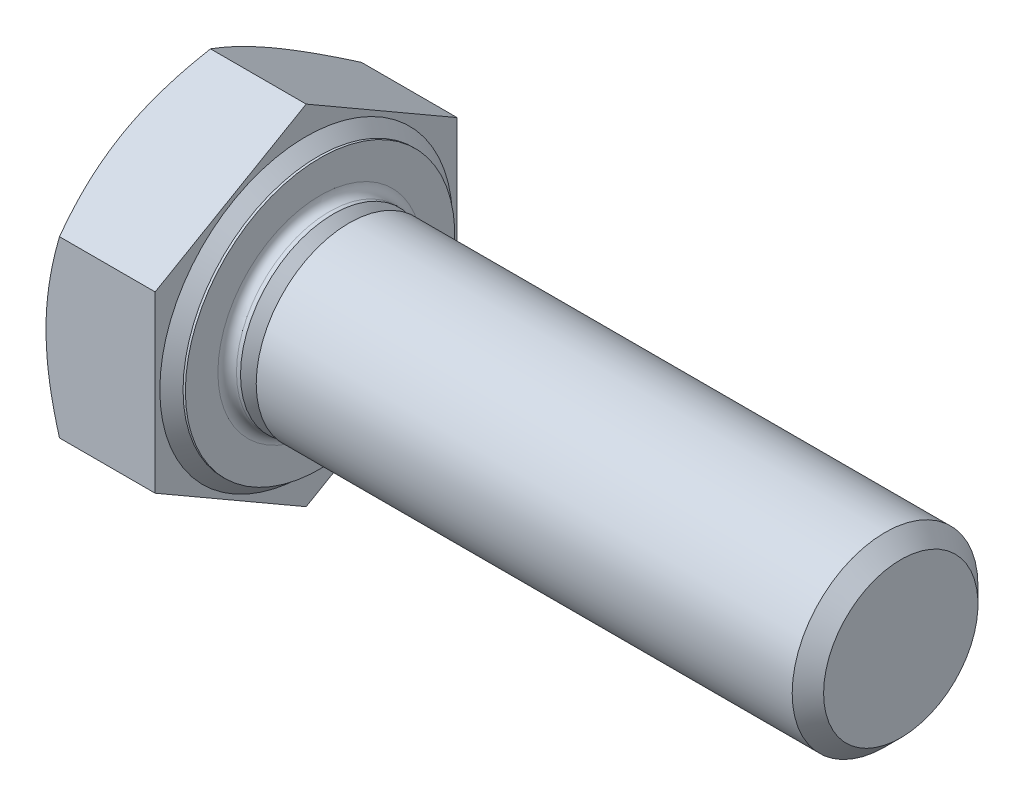
ISO-10303-21;
HEADER;
FILE_DESCRIPTION(('STEP AP214'),'2;1');
FILE_NAME('part.step','',(''),(''),'','','');
FILE_SCHEMA(('AUTOMOTIVE_DESIGN { 1 0 10303 214 1 1 1 1 }'));
ENDSEC;
DATA;
#1=APPLICATION_CONTEXT('core data for automotive mechanical design processes');
#2=APPLICATION_PROTOCOL_DEFINITION('international standard','automotive_design',2000,#1);
#3=PRODUCT_CONTEXT('',#1,'mechanical');
#4=PRODUCT('Part','Part','',(#3));
#5=PRODUCT_RELATED_PRODUCT_CATEGORY('part','',(#4));
#6=PRODUCT_DEFINITION_FORMATION('','',#4);
#7=PRODUCT_DEFINITION_CONTEXT('part definition',#1,'design');
#8=PRODUCT_DEFINITION('design','',#6,#7);
#9=PRODUCT_DEFINITION_SHAPE('','',#8);
#10=(LENGTH_UNIT() NAMED_UNIT(*) SI_UNIT(.MILLI.,.METRE.));
#11=(NAMED_UNIT(*) PLANE_ANGLE_UNIT() SI_UNIT($,.RADIAN.));
#12=(NAMED_UNIT(*) SI_UNIT($,.STERADIAN.) SOLID_ANGLE_UNIT());
#13=UNCERTAINTY_MEASURE_WITH_UNIT(LENGTH_MEASURE(1.E-05),#10,'distance_accuracy_value','');
#14=(GEOMETRIC_REPRESENTATION_CONTEXT(3) GLOBAL_UNCERTAINTY_ASSIGNED_CONTEXT((#13)) GLOBAL_UNIT_ASSIGNED_CONTEXT((#10,
#11,#12)) REPRESENTATION_CONTEXT('',''));
#15=CARTESIAN_POINT('',(0.,0.,0.));
#16=DIRECTION('',(0.,0.,1.));
#17=DIRECTION('',(1.,0.,0.));
#18=AXIS2_PLACEMENT_3D('',#15,#16,#17);
#19=CARTESIAN_POINT('',(0.,0.,0.));
#20=DIRECTION('',(-1.,0.,0.));
#21=DIRECTION('',(0.,0.,1.));
#22=AXIS2_PLACEMENT_3D('',#19,#20,#21);
#23=CYLINDRICAL_SURFACE('',#22,4.);
#24=CARTESIAN_POINT('',(1.,0.,0.));
#25=DIRECTION('',(-1.,0.,0.));
#26=DIRECTION('',(0.,0.,1.));
#27=AXIS2_PLACEMENT_3D('',#24,#25,#26);
#28=CIRCLE('',#27,4.);
#29=CARTESIAN_POINT('',(1.,0.,4.));
#30=VERTEX_POINT('',#29);
#31=EDGE_CURVE('E11',#30,#30,#28,.T.);
#32=ORIENTED_EDGE('',*,*,#31,.F.);
#33=EDGE_LOOP('',(#32));
#34=FACE_BOUND('',#33,.T.);
#35=CARTESIAN_POINT('',(1.1734375,0.,0.));
#36=DIRECTION('',(-1.,0.,0.));
#37=DIRECTION('',(0.,0.,1.));
#38=AXIS2_PLACEMENT_3D('',#35,#36,#37);
#39=CIRCLE('',#38,4.);
#40=CARTESIAN_POINT('',(1.1734375,0.,4.));
#41=VERTEX_POINT('',#40);
#42=EDGE_CURVE('E248',#41,#41,#39,.T.);
#43=ORIENTED_EDGE('',*,*,#42,.T.);
#44=EDGE_LOOP('',(#43));
#45=FACE_BOUND('',#44,.T.);
#46=ADVANCED_FACE('F16',(#34,#45),#23,.T.);
#47=CARTESIAN_POINT('',(25.6,0.,0.));
#48=DIRECTION('',(-1.,0.,0.));
#49=DIRECTION('',(0.,0.,1.));
#50=AXIS2_PLACEMENT_3D('',#47,#48,#49);
#51=PLANE('',#50);
#52=CARTESIAN_POINT('',(25.6,0.,0.));
#53=DIRECTION('',(-1.,0.,0.));
#54=DIRECTION('',(0.,0.,1.));
#55=AXIS2_PLACEMENT_3D('',#52,#53,#54);
#56=CIRCLE('',#55,3.3234375);
#57=CARTESIAN_POINT('',(25.6,0.,3.3234375));
#58=VERTEX_POINT('',#57);
#59=EDGE_CURVE('E128',#58,#58,#56,.T.);
#60=ORIENTED_EDGE('',*,*,#59,.F.);
#61=EDGE_LOOP('',(#60));
#62=FACE_BOUND('',#61,.T.);
#63=ADVANCED_FACE('F151',(#62),#51,.F.);
#64=CARTESIAN_POINT('',(25.6,0.,0.));
#65=DIRECTION('',(-1.,0.,0.));
#66=DIRECTION('',(0.,0.,1.));
#67=AXIS2_PLACEMENT_3D('',#64,#65,#66);
#68=CONICAL_SURFACE('',#67,3.3234375,0.785398163397447);
#69=CARTESIAN_POINT('',(24.9234375,0.,0.));
#70=DIRECTION('',(-1.,0.,0.));
#71=DIRECTION('',(0.,0.,1.));
#72=AXIS2_PLACEMENT_3D('',#69,#70,#71);
#73=CIRCLE('',#72,4.);
#74=CARTESIAN_POINT('',(24.9234375,0.,4.));
#75=VERTEX_POINT('',#74);
#76=EDGE_CURVE('E230',#75,#75,#73,.T.);
#77=ORIENTED_EDGE('',*,*,#76,.F.);
#78=EDGE_LOOP('',(#77));
#79=FACE_BOUND('',#78,.T.);
#80=ORIENTED_EDGE('',*,*,#59,.T.);
#81=EDGE_LOOP('',(#80));
#82=FACE_BOUND('',#81,.T.);
#83=ADVANCED_FACE('F204',(#79,#82),#68,.T.);
#84=CARTESIAN_POINT('',(0.,0.,0.));
#85=DIRECTION('',(-1.,0.,0.));
#86=DIRECTION('',(0.,0.,1.));
#87=AXIS2_PLACEMENT_3D('',#84,#85,#86);
#88=CYLINDRICAL_SURFACE('',#87,4.);
#89=CARTESIAN_POINT('',(1.85,0.,0.));
#90=DIRECTION('',(-1.,0.,0.));
#91=DIRECTION('',(0.,0.,1.));
#92=AXIS2_PLACEMENT_3D('',#89,#90,#91);
#93=CIRCLE('',#92,4.);
#94=CARTESIAN_POINT('',(1.85,0.,4.));
#95=VERTEX_POINT('',#94);
#96=EDGE_CURVE('E238',#95,#95,#93,.T.);
#97=ORIENTED_EDGE('',*,*,#96,.F.);
#98=EDGE_LOOP('',(#97));
#99=FACE_BOUND('',#98,.T.);
#100=ORIENTED_EDGE('',*,*,#76,.T.);
#101=EDGE_LOOP('',(#100));
#102=FACE_BOUND('',#101,.T.);
#103=ADVANCED_FACE('F219',(#99,#102),#88,.T.);
#104=CARTESIAN_POINT('',(1.85,4.,0.));
#105=DIRECTION('',(1.,0.,0.));
#106=DIRECTION('',(0.,0.,-1.));
#107=AXIS2_PLACEMENT_3D('',#104,#105,#106);
#108=PLANE('',#107);
#109=CARTESIAN_POINT('',(1.85,0.,0.));
#110=DIRECTION('',(-1.,0.,0.));
#111=DIRECTION('',(0.,0.,1.));
#112=AXIS2_PLACEMENT_3D('',#109,#110,#111);
#113=CIRCLE('',#112,3.3234375);
#114=CARTESIAN_POINT('',(1.85,0.,3.3234375));
#115=VERTEX_POINT('',#114);
#116=EDGE_CURVE('E244',#115,#115,#113,.T.);
#117=ORIENTED_EDGE('',*,*,#116,.F.);
#118=EDGE_LOOP('',(#117));
#119=FACE_BOUND('',#118,.T.);
#120=ORIENTED_EDGE('',*,*,#96,.T.);
#121=EDGE_LOOP('',(#120));
#122=FACE_BOUND('',#121,.T.);
#123=ADVANCED_FACE('F215',(#119,#122),#108,.F.);
#124=CARTESIAN_POINT('',(1.85,0.,0.));
#125=DIRECTION('',(-1.,0.,0.));
#126=DIRECTION('',(0.,0.,1.));
#127=AXIS2_PLACEMENT_3D('',#124,#125,#126);
#128=CONICAL_SURFACE('',#127,3.3234375,0.785398163397448);
#129=ORIENTED_EDGE('',*,*,#42,.F.);
#130=EDGE_LOOP('',(#129));
#131=FACE_BOUND('',#130,.T.);
#132=ORIENTED_EDGE('',*,*,#116,.T.);
#133=EDGE_LOOP('',(#132));
#134=FACE_BOUND('',#133,.T.);
#135=ADVANCED_FACE('F212',(#131,#134),#128,.T.);
#136=CARTESIAN_POINT('',(1.,0.,0.));
#137=DIRECTION('',(-1.,0.,0.));
#138=DIRECTION('',(0.,0.,1.));
#139=AXIS2_PLACEMENT_3D('',#136,#137,#138);
#140=TOROIDAL_SURFACE('',#139,4.4,0.4);
#141=ORIENTED_EDGE('',*,*,#31,.T.);
#142=EDGE_LOOP('',(#141));
#143=FACE_BOUND('',#142,.T.);
#144=CARTESIAN_POINT('',(0.6,0.,0.));
#145=DIRECTION('',(-1.,0.,0.));
#146=DIRECTION('',(0.,0.,1.));
#147=AXIS2_PLACEMENT_3D('',#144,#145,#146);
#148=CIRCLE('',#147,4.4);
#149=CARTESIAN_POINT('',(0.6,0.,4.4));
#150=VERTEX_POINT('',#149);
#151=EDGE_CURVE('E252',#150,#150,#148,.T.);
#152=ORIENTED_EDGE('',*,*,#151,.F.);
#153=EDGE_LOOP('',(#152));
#154=FACE_BOUND('',#153,.T.);
#155=ADVANCED_FACE('F210',(#143,#154),#140,.F.);
#156=CARTESIAN_POINT('',(0.6,5.8,0.));
#157=DIRECTION('',(1.,0.,0.));
#158=DIRECTION('',(0.,0.,-1.));
#159=AXIS2_PLACEMENT_3D('',#156,#157,#158);
#160=PLANE('',#159);
#161=ORIENTED_EDGE('',*,*,#151,.T.);
#162=EDGE_LOOP('',(#161));
#163=FACE_BOUND('',#162,.T.);
#164=CARTESIAN_POINT('',(0.6,0.,0.));
#165=DIRECTION('',(-1.,0.,0.));
#166=DIRECTION('',(0.,0.,1.));
#167=AXIS2_PLACEMENT_3D('',#164,#165,#166);
#168=CIRCLE('',#167,5.8);
#169=CARTESIAN_POINT('',(0.6,0.,5.8));
#170=VERTEX_POINT('',#169);
#171=EDGE_CURVE('E256',#170,#170,#168,.T.);
#172=ORIENTED_EDGE('',*,*,#171,.F.);
#173=EDGE_LOOP('',(#172));
#174=FACE_BOUND('',#173,.T.);
#175=ADVANCED_FACE('F286',(#163,#174),#160,.T.);
#176=CARTESIAN_POINT('',(-0.53,0.,0.));
#177=DIRECTION('',(-1.,0.,0.));
#178=DIRECTION('',(0.,0.,1.));
#179=AXIS2_PLACEMENT_3D('',#176,#177,#178);
#180=CYLINDRICAL_SURFACE('',#179,5.8);
#181=ORIENTED_EDGE('',*,*,#171,.T.);
#182=EDGE_LOOP('',(#181));
#183=FACE_BOUND('',#182,.T.);
#184=CARTESIAN_POINT('',(0.5,0.,0.));
#185=DIRECTION('',(-1.,0.,0.));
#186=DIRECTION('',(0.,0.,1.));
#187=AXIS2_PLACEMENT_3D('',#184,#185,#186);
#188=CIRCLE('',#187,5.8);
#189=CARTESIAN_POINT('',(0.5,0.,5.8));
#190=VERTEX_POINT('',#189);
#191=EDGE_CURVE('E260',#190,#190,#188,.T.);
#192=ORIENTED_EDGE('',*,*,#191,.F.);
#193=EDGE_LOOP('',(#192));
#194=FACE_BOUND('',#193,.T.);
#195=ADVANCED_FACE('F277',(#183,#194),#180,.T.);
#196=CARTESIAN_POINT('',(0.,0.,0.));
#197=DIRECTION('',(-1.,0.,0.));
#198=DIRECTION('',(0.,0.,1.));
#199=AXIS2_PLACEMENT_3D('',#196,#197,#198);
#200=CONICAL_SURFACE('',#199,6.3,0.785398163397449);
#201=ORIENTED_EDGE('',*,*,#191,.T.);
#202=EDGE_LOOP('',(#201));
#203=FACE_BOUND('',#202,.T.);
#204=CARTESIAN_POINT('',(0.,0.,0.));
#205=DIRECTION('',(-1.,0.,0.));
#206=DIRECTION('',(0.,0.,1.));
#207=AXIS2_PLACEMENT_3D('',#204,#205,#206);
#208=CIRCLE('',#207,6.3);
#209=CARTESIAN_POINT('',(0.,0.,6.3));
#210=VERTEX_POINT('',#209);
#211=EDGE_CURVE('E264',#210,#210,#208,.T.);
#212=ORIENTED_EDGE('',*,*,#211,.F.);
#213=EDGE_LOOP('',(#212));
#214=FACE_BOUND('',#213,.T.);
#215=ADVANCED_FACE('F274',(#203,#214),#200,.T.);
#216=CARTESIAN_POINT('',(-4.7,7.50555349946514,0.));
#217=DIRECTION('',(-1.,0.,0.));
#218=DIRECTION('',(0.,0.,1.));
#219=AXIS2_PLACEMENT_3D('',#216,#217,#218);
#220=PLANE('',#219);
#221=CARTESIAN_POINT('',(-4.7,0.,0.));
#222=DIRECTION('',(-1.,0.,0.));
#223=DIRECTION('',(0.,0.,1.));
#224=AXIS2_PLACEMENT_3D('',#221,#222,#223);
#225=CIRCLE('',#224,6.5);
#226=CARTESIAN_POINT('',(-4.7,-5.62916512459885,3.25));
#227=VERTEX_POINT('',#226);
#228=CARTESIAN_POINT('',(-4.7,0.,6.5));
#229=VERTEX_POINT('',#228);
#230=EDGE_CURVE('E533',#227,#229,#225,.T.);
#231=ORIENTED_EDGE('',*,*,#230,.T.);
#232=CARTESIAN_POINT('',(-4.7,5.62916512459885,3.25));
#233=VERTEX_POINT('',#232);
#234=EDGE_CURVE('E26',#229,#233,#225,.T.);
#235=ORIENTED_EDGE('',*,*,#234,.T.);
#236=CARTESIAN_POINT('',(-4.7,5.62916512459885,-3.25));
#237=VERTEX_POINT('',#236);
#238=EDGE_CURVE('E541',#233,#237,#225,.T.);
#239=ORIENTED_EDGE('',*,*,#238,.T.);
#240=CARTESIAN_POINT('',(-4.7,0.,0.));
#241=DIRECTION('',(1.,0.,0.));
#242=DIRECTION('',(0.,0.,-1.));
#243=AXIS2_PLACEMENT_3D('',#240,#241,#242);
#244=CIRCLE('',#243,6.5);
#245=CARTESIAN_POINT('',(-4.7,0.,-6.5));
#246=VERTEX_POINT('',#245);
#247=EDGE_CURVE('E119',#246,#237,#244,.T.);
#248=ORIENTED_EDGE('',*,*,#247,.F.);
#249=CARTESIAN_POINT('',(-4.7,-5.62916512459885,-3.25));
#250=VERTEX_POINT('',#249);
#251=EDGE_CURVE('E540',#246,#250,#225,.T.);
#252=ORIENTED_EDGE('',*,*,#251,.T.);
#253=EDGE_CURVE('E535',#250,#227,#225,.T.);
#254=ORIENTED_EDGE('',*,*,#253,.T.);
#255=EDGE_LOOP('',(#231,#235,#239,#248,#252,#254));
#256=FACE_BOUND('',#255,.T.);
#257=ADVANCED_FACE('F276',(#256),#220,.T.);
#258=CARTESIAN_POINT('',(-4.11831960379145,0.,0.));
#259=DIRECTION('',(1.,0.,0.));
#260=DIRECTION('',(0.,0.,-1.));
#261=AXIS2_PLACEMENT_3D('',#258,#259,#260);
#262=CONICAL_SURFACE('',#261,7.5075,1.0471975511966);
#263=ORIENTED_EDGE('',*,*,#247,.T.);
#264=CARTESIAN_POINT('',(-4.11944274973242,7.50555465416567,2.00000000051254E-06));
#265=CARTESIAN_POINT('',(-4.16705884776377,7.42306527723568,-0.142873791927457));
#266=CARTESIAN_POINT('',(-4.21251377350587,7.34026834106243,-0.286282292090553));
#267=CARTESIAN_POINT('',(-4.29850607721117,7.17400208014973,-0.574263903575869));
#268=CARTESIAN_POINT('',(-4.33904133382285,7.09053248178624,-0.718837488828803));
#269=CARTESIAN_POINT('',(-4.45247188162342,6.83878732720467,-1.15487288712335));
#270=CARTESIAN_POINT('',(-4.51698888095725,6.669518078939,-1.44805582527849));
#271=CARTESIAN_POINT('',(-4.59264087408676,6.4162097489077,-1.88679872287313));
#272=CARTESIAN_POINT('',(-4.61419158213611,6.33292745266914,-2.03104789132931));
#273=CARTESIAN_POINT('',(-4.65032811462334,6.1659866033475,-2.32019792421309));
#274=CARTESIAN_POINT('',(-4.66491455442238,6.082328084167,-2.46509872991969));
#275=CARTESIAN_POINT('',(-4.68675081186109,5.91486579606872,-2.75515192125765));
#276=CARTESIAN_POINT('',(-4.69400895467766,5.83106230055644,-2.9003038333368));
#277=CARTESIAN_POINT('',(-4.70104077822539,5.66338258203352,-3.19073362521733));
#278=CARTESIAN_POINT('',(-4.70081469025906,5.5795063613506,-3.33601150098701));
#279=CARTESIAN_POINT('',(-4.68990852719947,5.34972711742178,-3.73400082599649));
#280=CARTESIAN_POINT('',(-4.6716090682129,5.20389935455449,-3.98658192043674));
#281=CARTESIAN_POINT('',(-4.61358751925144,4.9132123784665,-4.4900665321197));
#282=CARTESIAN_POINT('',(-4.57384560824827,4.76835418712971,-4.74096827940756));
#283=CARTESIAN_POINT('',(-4.4745047971726,4.47708246697614,-5.24546569752153));
#284=CARTESIAN_POINT('',(-4.414485106267,4.33070568094782,-5.49899772797121));
#285=CARTESIAN_POINT('',(-4.2782655581894,4.04013468328329,-6.00228145913216));
#286=CARTESIAN_POINT('',(-4.2020976871334,3.89593675196616,-6.25203960251976));
#287=CARTESIAN_POINT('',(-4.11944274973242,3.75277559503204,-6.500002));
#288=B_SPLINE_CURVE_WITH_KNOTS('',3,(#264,#265,#266,#267,#268,#269,#270,#271,#272,#273,#274,
#275,#276,#277,#278,#279,#280,#281,#282,#283,#284,#285,#286,#287),.UNSPECIFIED.,.F.,.F.,(4,2,2,
2,2,2,2,2,2,2,2,4),(0.,0.515097230812098,1.03041578730196,2.06319381753069,2.56693508465116,
3.07063183306576,3.5737557200387,4.07686405782423,4.95263248446345,5.82921184659662,
6.72522956997886,7.61948878328293),.UNSPECIFIED.);
#289=CARTESIAN_POINT('',(-4.11944341639923,3.75277674973257,-6.5));
#290=VERTEX_POINT('',#289);
#291=EDGE_CURVE('E169',#237,#290,#288,.T.);
#292=ORIENTED_EDGE('',*,*,#291,.T.);
#293=CARTESIAN_POINT('',(-1.58950106586409,-9.95307285908935,-6.5));
#294=CARTESIAN_POINT('',(-1.72741694462485,-9.66768488978743,-6.5));
#295=CARTESIAN_POINT('',(-1.86396187262552,-9.38162218475457,-6.5));
#296=CARTESIAN_POINT('',(-2.13352642358591,-8.80778247979371,-6.5));
#297=CARTESIAN_POINT('',(-2.26654543621498,-8.52000519349762,-6.5));
#298=CARTESIAN_POINT('',(-2.52897547035035,-7.94081702987501,-6.5));
#299=CARTESIAN_POINT('',(-2.65836149012832,-7.64939478323306,-6.5));
#300=CARTESIAN_POINT('',(-2.91157630682606,-7.06415509657549,-6.5));
#301=CARTESIAN_POINT('',(-3.03540539340509,-6.77033778235014,-6.5));
#302=CARTESIAN_POINT('',(-3.27749909631482,-6.17619249466496,-6.5));
#303=CARTESIAN_POINT('',(-3.39567671308663,-5.875828877051,-6.5));
#304=CARTESIAN_POINT('',(-3.62277662595523,-5.27155865332413,-6.5));
#305=CARTESIAN_POINT('',(-3.73169789235064,-4.96765165730142,-6.5));
#306=CARTESIAN_POINT('',(-3.93735883659429,-4.35643639784011,-6.5));
#307=CARTESIAN_POINT('',(-4.03412441108149,-4.04913693634066,-6.5));
#308=CARTESIAN_POINT('',(-4.21233031373958,-3.43016616038199,-6.5));
#309=CARTESIAN_POINT('',(-4.29377548814037,-3.11849626203734,-6.5));
#310=CARTESIAN_POINT('',(-4.43739091972401,-2.49058681273853,-6.5));
#311=CARTESIAN_POINT('',(-4.499556053006,-2.17434607035872,-6.5));
#312=CARTESIAN_POINT('',(-4.60041039162963,-1.53800734029216,-6.5));
#313=CARTESIAN_POINT('',(-4.63909957638743,-1.21790934922361,-6.5));
#314=CARTESIAN_POINT('',(-4.67704622673573,-0.737252871284539,-6.5));
#315=CARTESIAN_POINT('',(-4.68634917626868,-0.577446868410645,-6.5));
#316=CARTESIAN_POINT('',(-4.69818345264611,-0.25757696766978,-6.5));
#317=CARTESIAN_POINT('',(-4.70071486744556,-0.0975130731795666,-6.5));
#318=CARTESIAN_POINT('',(-4.69893807889715,0.222530422340155,-6.5));
#319=CARTESIAN_POINT('',(-4.69463179526147,0.38251003441898,-6.5));
#320=CARTESIAN_POINT('',(-4.67928875033018,0.702148832131744,-6.5));
#321=CARTESIAN_POINT('',(-4.66825165286501,0.861808001361585,-6.5));
#322=CARTESIAN_POINT('',(-4.63357430266791,1.2487675251381,-6.5));
#323=CARTESIAN_POINT('',(-4.60656168522891,1.47577055977927,-6.5));
#324=CARTESIAN_POINT('',(-4.54042863403666,1.9280372928636,-6.5));
#325=CARTESIAN_POINT('',(-4.5013048955893,2.15330049935345,-6.5));
#326=CARTESIAN_POINT('',(-4.41233712827938,2.60190162254787,-6.5));
#327=CARTESIAN_POINT('',(-4.36248296370137,2.82523750985594,-6.5));
#328=CARTESIAN_POINT('',(-4.25357548053456,3.26961152922599,-6.5));
#329=CARTESIAN_POINT('',(-4.1945230285317,3.49064987565262,-6.5));
#330=CARTESIAN_POINT('',(-4.06708805222781,3.93587314871608,-6.5));
#331=CARTESIAN_POINT('',(-3.99851230201414,4.16000238632251,-6.5));
#332=CARTESIAN_POINT('',(-3.85458478908547,4.60589181343481,-6.5));
#333=CARTESIAN_POINT('',(-3.77923769993311,4.82765352051654,-6.5));
#334=CARTESIAN_POINT('',(-3.62332390471417,5.26791804038343,-6.5));
#335=CARTESIAN_POINT('',(-3.54278896471665,5.48643217049916,-6.5));
#336=CARTESIAN_POINT('',(-3.37699192799453,5.92176503585599,-6.5));
#337=CARTESIAN_POINT('',(-3.29172792084594,6.13858304495038,-6.5));
#338=CARTESIAN_POINT('',(-3.20456718200001,6.35461336357443,-6.5));
#339=B_SPLINE_CURVE_WITH_KNOTS('',3,(#293,#294,#295,#296,#297,#298,#299,#300,#301,#302,#303,
#304,#305,#306,#307,#308,#309,#310,#311,#312,#313,#314,#315,#316,#317,#318,#319,#320,#321,#322,
#323,#324,#325,#326,#327,#328,#329,#330,#331,#332,#333,#334,#335,#336,#337,#338),.UNSPECIFIED.,
.F.,.F.,(4,2,2,2,2,2,2,2,2,2,2,2,2,2,2,2,2,2,2,2,2,2,4),(0.,0.950909051370075,1.90198164276349,
2.85849656625615,3.8149615726478,4.78317137315414,5.75148873932466,6.71770688363886,
7.68361887285432,8.64978734516564,9.61595666461727,10.0960644432439,10.5761659857554,
11.0561327615996,11.5361235112802,12.2215554610679,12.9071746059577,13.5934442356332,
14.2796492497687,14.9826753898829,15.6852199758561,16.3838102365337,17.0826847952346),.UNSPECIFIED.);
#340=EDGE_CURVE('E176',#290,#246,#339,.F.);
#341=ORIENTED_EDGE('',*,*,#340,.T.);
#342=EDGE_LOOP('',(#263,#292,#341));
#343=FACE_BOUND('',#342,.T.);
#344=ADVANCED_FACE('F284',(#343),#262,.T.);
#345=ORIENTED_EDGE('',*,*,#251,.F.);
#346=CARTESIAN_POINT('',(-4.11944341639923,-3.75277674973256,-6.5));
#347=VERTEX_POINT('',#346);
#348=EDGE_CURVE('E41',#246,#347,#339,.F.);
#349=ORIENTED_EDGE('',*,*,#348,.T.);
#350=CARTESIAN_POINT('',(-4.11944274973242,-3.75277559503203,-6.500002));
#351=CARTESIAN_POINT('',(-4.16705884776377,-3.83526497196203,-6.35712620807254));
#352=CARTESIAN_POINT('',(-4.21251377350587,-3.91806190813527,-6.21371770790945));
#353=CARTESIAN_POINT('',(-4.29850607721118,-4.08432816904798,-5.92573609642413));
#354=CARTESIAN_POINT('',(-4.33904133382286,-4.16779776741147,-5.7811625111712));
#355=CARTESIAN_POINT('',(-4.45247188162342,-4.41954292199303,-5.34512711287665));
#356=CARTESIAN_POINT('',(-4.51698888095725,-4.5888121702587,-5.05194417472151));
#357=CARTESIAN_POINT('',(-4.59264087408676,-4.84212050029001,-4.61320127712688));
#358=CARTESIAN_POINT('',(-4.61419158213611,-4.92540279652856,-4.4689521086707));
#359=CARTESIAN_POINT('',(-4.65032811462334,-5.0923436458502,-4.17980207578691));
#360=CARTESIAN_POINT('',(-4.66491455442238,-5.1760021650307,-4.03490127008031));
#361=CARTESIAN_POINT('',(-4.68675081186109,-5.34346445312898,-3.74484807874235));
#362=CARTESIAN_POINT('',(-4.69400895467766,-5.42726794864126,-3.59969616666321));
#363=CARTESIAN_POINT('',(-4.7010407782254,-5.59494766716418,-3.30926637478268));
#364=CARTESIAN_POINT('',(-4.70081469025906,-5.6788238878471,-3.163988499013));
#365=CARTESIAN_POINT('',(-4.68990852719947,-5.90860313177592,-2.76599917400351));
#366=CARTESIAN_POINT('',(-4.67160906821291,-6.05443089464321,-2.51341807956326));
#367=CARTESIAN_POINT('',(-4.61358751925144,-6.3451178707312,-2.0099334678803));
#368=CARTESIAN_POINT('',(-4.57384560824827,-6.48997606206799,-1.75903172059245));
#369=CARTESIAN_POINT('',(-4.4745047971726,-6.78124778222157,-1.25453430247847));
#370=CARTESIAN_POINT('',(-4.414485106267,-6.92762456824988,-1.00100227202879));
#371=CARTESIAN_POINT('',(-4.27826555818941,-7.21819556591442,-0.497718540867837));
#372=CARTESIAN_POINT('',(-4.2020976871334,-7.36239349723155,-0.247960397480243));
#373=CARTESIAN_POINT('',(-4.11944274973242,-7.50555465416567,1.9999999985867E-06));
#374=B_SPLINE_CURVE_WITH_KNOTS('',3,(#350,#351,#352,#353,#354,#355,#356,#357,#358,#359,#360,
#361,#362,#363,#364,#365,#366,#367,#368,#369,#370,#371,#372,#373),.UNSPECIFIED.,.F.,.F.,(4,2,2,
2,2,2,2,2,2,2,2,4),(0.,0.515097230812098,1.03041578730196,2.06319381753069,2.56693508465116,
3.07063183306576,3.57375572003869,4.07686405782423,4.95263248446345,5.82921184659662,
6.72522956997886,7.61948878328294),.UNSPECIFIED.);
#375=EDGE_CURVE('E552',#347,#250,#374,.T.);
#376=ORIENTED_EDGE('',*,*,#375,.T.);
#377=EDGE_LOOP('',(#345,#349,#376));
#378=FACE_BOUND('',#377,.T.);
#379=ADVANCED_FACE('F398',(#378),#262,.T.);
#380=ORIENTED_EDGE('',*,*,#253,.F.);
#381=CARTESIAN_POINT('',(-4.11944341639923,-7.50555349946514,0.));
#382=VERTEX_POINT('',#381);
#383=EDGE_CURVE('E33',#250,#382,#374,.T.);
#384=ORIENTED_EDGE('',*,*,#383,.T.);
#385=CARTESIAN_POINT('',(-4.11944274973242,-7.50555465416567,-2.0000000012458E-06));
#386=CARTESIAN_POINT('',(-4.16705884776377,-7.42306527723568,0.142873791927456));
#387=CARTESIAN_POINT('',(-4.21251377350587,-7.34026834106243,0.286282292090552));
#388=CARTESIAN_POINT('',(-4.29850607721118,-7.17400208014973,0.574263903575868));
#389=CARTESIAN_POINT('',(-4.33904133382286,-7.09053248178624,0.718837488828802));
#390=CARTESIAN_POINT('',(-4.45247188162342,-6.83878732720467,1.15487288712335));
#391=CARTESIAN_POINT('',(-4.51698888095725,-6.669518078939,1.44805582527849));
#392=CARTESIAN_POINT('',(-4.59264087408676,-6.4162097489077,1.88679872287313));
#393=CARTESIAN_POINT('',(-4.61419158213611,-6.33292745266914,2.0310478913293));
#394=CARTESIAN_POINT('',(-4.65032811462334,-6.1659866033475,2.32019792421309));
#395=CARTESIAN_POINT('',(-4.66491455442238,-6.082328084167,2.46509872991969));
#396=CARTESIAN_POINT('',(-4.68675081186109,-5.91486579606872,2.75515192125765));
#397=CARTESIAN_POINT('',(-4.69400895467766,-5.83106230055644,2.90030383333679));
#398=CARTESIAN_POINT('',(-4.70104077822539,-5.66338258203352,3.19073362521733));
#399=CARTESIAN_POINT('',(-4.70081469025906,-5.5795063613506,3.33601150098701));
#400=CARTESIAN_POINT('',(-4.68990852719947,-5.34972711742178,3.73400082599649));
#401=CARTESIAN_POINT('',(-4.6716090682129,-5.20389935455449,3.98658192043674));
#402=CARTESIAN_POINT('',(-4.61358751925144,-4.9132123784665,4.4900665321197));
#403=CARTESIAN_POINT('',(-4.57384560824827,-4.76835418712971,4.74096827940756));
#404=CARTESIAN_POINT('',(-4.4745047971726,-4.47708246697614,5.24546569752153));
#405=CARTESIAN_POINT('',(-4.414485106267,-4.33070568094782,5.49899772797121));
#406=CARTESIAN_POINT('',(-4.2782655581894,-4.04013468328329,6.00228145913216));
#407=CARTESIAN_POINT('',(-4.2020976871334,-3.89593675196616,6.25203960251976));
#408=CARTESIAN_POINT('',(-4.11944274973242,-3.75277559503204,6.500002));
#409=B_SPLINE_CURVE_WITH_KNOTS('',3,(#385,#386,#387,#388,#389,#390,#391,#392,#393,#394,#395,
#396,#397,#398,#399,#400,#401,#402,#403,#404,#405,#406,#407,#408),.UNSPECIFIED.,.F.,.F.,(4,2,2,
2,2,2,2,2,2,2,2,4),(0.,0.515097230812098,1.03041578730196,2.06319381753069,2.56693508465116,
3.07063183306576,3.5737557200387,4.07686405782423,4.95263248446346,5.82921184659663,
6.72522956997886,7.61948878328294),.UNSPECIFIED.);
#410=EDGE_CURVE('E554',#382,#227,#409,.T.);
#411=ORIENTED_EDGE('',*,*,#410,.T.);
#412=EDGE_LOOP('',(#380,#384,#411));
#413=FACE_BOUND('',#412,.T.);
#414=ADVANCED_FACE('F409',(#413),#262,.T.);
#415=ORIENTED_EDGE('',*,*,#230,.F.);
#416=CARTESIAN_POINT('',(-4.11944341639923,-3.75277674973257,6.5));
#417=VERTEX_POINT('',#416);
#418=EDGE_CURVE('E125',#227,#417,#409,.T.);
#419=ORIENTED_EDGE('',*,*,#418,.T.);
#420=CARTESIAN_POINT('',(-1.58950106586409,-9.95307285908936,6.5));
#421=CARTESIAN_POINT('',(-1.72741694462485,-9.66768488978744,6.5));
#422=CARTESIAN_POINT('',(-1.86396187262552,-9.38162218475458,6.5));
#423=CARTESIAN_POINT('',(-2.13352642358591,-8.80778247979371,6.5));
#424=CARTESIAN_POINT('',(-2.26654543621498,-8.52000519349762,6.5));
#425=CARTESIAN_POINT('',(-2.52897547035035,-7.94081702987502,6.5));
#426=CARTESIAN_POINT('',(-2.65836149012832,-7.64939478323306,6.5));
#427=CARTESIAN_POINT('',(-2.91157630682606,-7.0641550965755,6.5));
#428=CARTESIAN_POINT('',(-3.03540539340509,-6.77033778235014,6.5));
#429=CARTESIAN_POINT('',(-3.27749909631482,-6.17619249466497,6.5));
#430=CARTESIAN_POINT('',(-3.39567671308663,-5.875828877051,6.5));
#431=CARTESIAN_POINT('',(-3.62277662595523,-5.27155865332413,6.5));
#432=CARTESIAN_POINT('',(-3.73169789235064,-4.96765165730142,6.5));
#433=CARTESIAN_POINT('',(-3.93735883659429,-4.35643639784011,6.5));
#434=CARTESIAN_POINT('',(-4.03412441108149,-4.04913693634066,6.5));
#435=CARTESIAN_POINT('',(-4.21233031373958,-3.43016616038199,6.5));
#436=CARTESIAN_POINT('',(-4.29377548814037,-3.11849626203734,6.5));
#437=CARTESIAN_POINT('',(-4.43739091972401,-2.49058681273853,6.5));
#438=CARTESIAN_POINT('',(-4.499556053006,-2.17434607035872,6.5));
#439=CARTESIAN_POINT('',(-4.60041039162963,-1.53800734029216,6.5));
#440=CARTESIAN_POINT('',(-4.63909957638743,-1.21790934922361,6.5));
#441=CARTESIAN_POINT('',(-4.67704622673573,-0.737252871284543,6.5));
#442=CARTESIAN_POINT('',(-4.68634917626868,-0.577446868410649,6.5));
#443=CARTESIAN_POINT('',(-4.69818345264611,-0.257576967669785,6.5));
#444=CARTESIAN_POINT('',(-4.70071486744556,-0.0975130731795718,6.5));
#445=CARTESIAN_POINT('',(-4.69893807889715,0.222530422340149,6.5));
#446=CARTESIAN_POINT('',(-4.69463179526147,0.382510034418973,6.5));
#447=CARTESIAN_POINT('',(-4.67928875033018,0.702148832131737,6.5));
#448=CARTESIAN_POINT('',(-4.66825165286501,0.861808001361579,6.5));
#449=CARTESIAN_POINT('',(-4.63357430266791,1.2487675251381,6.5));
#450=CARTESIAN_POINT('',(-4.60656168522891,1.47577055977927,6.5));
#451=CARTESIAN_POINT('',(-4.54042863403666,1.92803729286359,6.5));
#452=CARTESIAN_POINT('',(-4.5013048955893,2.15330049935344,6.5));
#453=CARTESIAN_POINT('',(-4.41233712827938,2.60190162254787,6.5));
#454=CARTESIAN_POINT('',(-4.36248296370137,2.82523750985593,6.5));
#455=CARTESIAN_POINT('',(-4.25357548053456,3.26961152922598,6.5));
#456=CARTESIAN_POINT('',(-4.1945230285317,3.49064987565261,6.5));
#457=CARTESIAN_POINT('',(-4.06708805222781,3.93587314871607,6.5));
#458=CARTESIAN_POINT('',(-3.99851230201414,4.16000238632251,6.50000000000001));
#459=CARTESIAN_POINT('',(-3.85458478908547,4.6058918134348,6.50000000000001));
#460=CARTESIAN_POINT('',(-3.77923769993311,4.82765352051654,6.50000000000001));
#461=CARTESIAN_POINT('',(-3.62332390471417,5.26791804038342,6.50000000000001));
#462=CARTESIAN_POINT('',(-3.54278896471665,5.48643217049916,6.50000000000001));
#463=CARTESIAN_POINT('',(-3.37699192799453,5.92176503585598,6.5));
#464=CARTESIAN_POINT('',(-3.29172792084594,6.13858304495037,6.5));
#465=CARTESIAN_POINT('',(-3.20456718200001,6.35461336357442,6.5));
#466=B_SPLINE_CURVE_WITH_KNOTS('',3,(#420,#421,#422,#423,#424,#425,#426,#427,#428,#429,#430,
#431,#432,#433,#434,#435,#436,#437,#438,#439,#440,#441,#442,#443,#444,#445,#446,#447,#448,#449,
#450,#451,#452,#453,#454,#455,#456,#457,#458,#459,#460,#461,#462,#463,#464,#465),.UNSPECIFIED.,
.F.,.F.,(4,2,2,2,2,2,2,2,2,2,2,2,2,2,2,2,2,2,2,2,2,2,4),(0.,0.950909051370076,1.90198164276349,
2.85849656625616,3.8149615726478,4.78317137315414,5.75148873932467,6.71770688363887,
7.68361887285433,8.64978734516565,9.61595666461727,10.0960644432439,10.5761659857554,
11.0561327615996,11.5361235112802,12.2215554610679,12.9071746059577,13.5934442356332,
14.2796492497687,14.982675389883,15.6852199758561,16.3838102365337,17.0826847952346),.UNSPECIFIED.);
#467=EDGE_CURVE('E118',#417,#229,#466,.T.);
#468=ORIENTED_EDGE('',*,*,#467,.T.);
#469=EDGE_LOOP('',(#415,#419,#468));
#470=FACE_BOUND('',#469,.T.);
#471=ADVANCED_FACE('F150',(#470),#262,.T.);
#472=ORIENTED_EDGE('',*,*,#238,.F.);
#473=CARTESIAN_POINT('',(-4.11944274973242,3.75277559503203,6.500002));
#474=CARTESIAN_POINT('',(-4.16705884776377,3.83526497196202,6.35712620807255));
#475=CARTESIAN_POINT('',(-4.21251377350587,3.91806190813527,6.21371770790945));
#476=CARTESIAN_POINT('',(-4.29850607721118,4.08432816904798,5.92573609642414));
#477=CARTESIAN_POINT('',(-4.33904133382286,4.16779776741147,5.7811625111712));
#478=CARTESIAN_POINT('',(-4.45247188162342,4.41954292199303,5.34512711287665));
#479=CARTESIAN_POINT('',(-4.51698888095725,4.5888121702587,5.05194417472151));
#480=CARTESIAN_POINT('',(-4.59264087408676,4.84212050029,4.61320127712688));
#481=CARTESIAN_POINT('',(-4.61419158213611,4.92540279652856,4.4689521086707));
#482=CARTESIAN_POINT('',(-4.65032811462334,5.0923436458502,4.17980207578691));
#483=CARTESIAN_POINT('',(-4.66491455442238,5.1760021650307,4.03490127008031));
#484=CARTESIAN_POINT('',(-4.68675081186109,5.34346445312898,3.74484807874235));
#485=CARTESIAN_POINT('',(-4.69400895467766,5.42726794864126,3.59969616666321));
#486=CARTESIAN_POINT('',(-4.70104077822539,5.59494766716418,3.30926637478268));
#487=CARTESIAN_POINT('',(-4.70081469025906,5.6788238878471,3.163988499013));
#488=CARTESIAN_POINT('',(-4.68990852719947,5.90860313177592,2.76599917400351));
#489=CARTESIAN_POINT('',(-4.67160906821291,6.05443089464321,2.51341807956326));
#490=CARTESIAN_POINT('',(-4.61358751925144,6.3451178707312,2.0099334678803));
#491=CARTESIAN_POINT('',(-4.57384560824827,6.48997606206799,1.75903172059244));
#492=CARTESIAN_POINT('',(-4.4745047971726,6.78124778222157,1.25453430247847));
#493=CARTESIAN_POINT('',(-4.414485106267,6.92762456824988,1.00100227202879));
#494=CARTESIAN_POINT('',(-4.27826555818941,7.21819556591442,0.497718540867836));
#495=CARTESIAN_POINT('',(-4.2020976871334,7.36239349723155,0.247960397480243));
#496=CARTESIAN_POINT('',(-4.11944274973242,7.50555465416567,-1.99999999926572E-06));
#497=B_SPLINE_CURVE_WITH_KNOTS('',3,(#473,#474,#475,#476,#477,#478,#479,#480,#481,#482,#483,
#484,#485,#486,#487,#488,#489,#490,#491,#492,#493,#494,#495,#496),.UNSPECIFIED.,.F.,.F.,(4,2,2,
2,2,2,2,2,2,2,2,4),(0.,0.515097230812098,1.03041578730196,2.06319381753069,2.56693508465116,
3.07063183306576,3.5737557200387,4.07686405782423,4.95263248446346,5.82921184659663,
6.72522956997887,7.61948878328294),.UNSPECIFIED.);
#498=CARTESIAN_POINT('',(-4.11944341639923,7.50555349946514,0.));
#499=VERTEX_POINT('',#498);
#500=EDGE_CURVE('E108',#233,#499,#497,.T.);
#501=ORIENTED_EDGE('',*,*,#500,.T.);
#502=EDGE_CURVE('E175',#499,#237,#288,.T.);
#503=ORIENTED_EDGE('',*,*,#502,.T.);
#504=EDGE_LOOP('',(#472,#501,#503));
#505=FACE_BOUND('',#504,.T.);
#506=ADVANCED_FACE('F149',(#505),#262,.T.);
#507=CARTESIAN_POINT('',(-4.11944341639923,3.75277674973256,6.5));
#508=VERTEX_POINT('',#507);
#509=EDGE_CURVE('E94',#229,#508,#466,.T.);
#510=ORIENTED_EDGE('',*,*,#509,.T.);
#511=EDGE_CURVE('E105',#508,#233,#497,.T.);
#512=ORIENTED_EDGE('',*,*,#511,.T.);
#513=ORIENTED_EDGE('',*,*,#234,.F.);
#514=EDGE_LOOP('',(#510,#512,#513));
#515=FACE_BOUND('',#514,.T.);
#516=ADVANCED_FACE('F114',(#515),#262,.T.);
#517=CARTESIAN_POINT('',(-4.7,7.50555349946514,0.));
#518=DIRECTION('',(0.,-0.866025403784439,0.5));
#519=DIRECTION('',(0.,0.5,0.866025403784439));
#520=AXIS2_PLACEMENT_3D('',#517,#518,#519);
#521=PLANE('',#520);
#522=ORIENTED_EDGE('',*,*,#502,.F.);
#523=DIRECTION('',(1.,0.,0.));
#524=VECTOR('',#523,1.);
#525=CARTESIAN_POINT('',(-4.7,7.50555349946514,0.));
#526=LINE('',#525,#524);
#527=CARTESIAN_POINT('',(0.,7.50555349946514,0.));
#528=VERTEX_POINT('',#527);
#529=EDGE_CURVE('E532',#499,#528,#526,.T.);
#530=ORIENTED_EDGE('',*,*,#529,.T.);
#531=DIRECTION('',(0.,-0.5,-0.866025403784439));
#532=VECTOR('',#531,1.);
#533=CARTESIAN_POINT('',(0.,7.50555349946514,0.));
#534=LINE('',#533,#532);
#535=CARTESIAN_POINT('',(0.,3.75277674973257,-6.5));
#536=VERTEX_POINT('',#535);
#537=EDGE_CURVE('E517',#528,#536,#534,.T.);
#538=ORIENTED_EDGE('',*,*,#537,.T.);
#539=DIRECTION('',(1.,0.,0.));
#540=VECTOR('',#539,1.);
#541=CARTESIAN_POINT('',(-4.7,3.75277674973257,-6.5));
#542=LINE('',#541,#540);
#543=EDGE_CURVE('E530',#290,#536,#542,.T.);
#544=ORIENTED_EDGE('',*,*,#543,.F.);
#545=ORIENTED_EDGE('',*,*,#291,.F.);
#546=EDGE_LOOP('',(#522,#530,#538,#544,#545));
#547=FACE_BOUND('',#546,.T.);
#548=ADVANCED_FACE('F148',(#547),#521,.F.);
#549=CARTESIAN_POINT('',(-4.7,3.75277674973257,-6.5));
#550=DIRECTION('',(0.,0.,1.));
#551=DIRECTION('',(0.,1.,0.));
#552=AXIS2_PLACEMENT_3D('',#549,#550,#551);
#553=PLANE('',#552);
#554=ORIENTED_EDGE('',*,*,#340,.F.);
#555=ORIENTED_EDGE('',*,*,#543,.T.);
#556=DIRECTION('',(0.,-1.,0.));
#557=VECTOR('',#556,1.);
#558=CARTESIAN_POINT('',(0.,3.75277674973257,-6.5));
#559=LINE('',#558,#557);
#560=CARTESIAN_POINT('',(0.,-3.75277674973256,-6.5));
#561=VERTEX_POINT('',#560);
#562=EDGE_CURVE('E521',#536,#561,#559,.T.);
#563=ORIENTED_EDGE('',*,*,#562,.T.);
#564=DIRECTION('',(1.,0.,0.));
#565=VECTOR('',#564,1.);
#566=CARTESIAN_POINT('',(-4.7,-3.75277674973256,-6.5));
#567=LINE('',#566,#565);
#568=EDGE_CURVE('E528',#347,#561,#567,.T.);
#569=ORIENTED_EDGE('',*,*,#568,.F.);
#570=ORIENTED_EDGE('',*,*,#348,.F.);
#571=EDGE_LOOP('',(#554,#555,#563,#569,#570));
#572=FACE_BOUND('',#571,.T.);
#573=ADVANCED_FACE('F183',(#572),#553,.F.);
#574=CARTESIAN_POINT('',(-4.7,-3.75277674973256,-6.5));
#575=DIRECTION('',(0.,0.866025403784439,0.5));
#576=DIRECTION('',(0.,0.5,-0.866025403784439));
#577=AXIS2_PLACEMENT_3D('',#574,#575,#576);
#578=PLANE('',#577);
#579=ORIENTED_EDGE('',*,*,#375,.F.);
#580=ORIENTED_EDGE('',*,*,#568,.T.);
#581=DIRECTION('',(0.,-0.5,0.866025403784439));
#582=VECTOR('',#581,1.);
#583=CARTESIAN_POINT('',(0.,-3.75277674973256,-6.5));
#584=LINE('',#583,#582);
#585=CARTESIAN_POINT('',(0.,-7.50555349946514,0.));
#586=VERTEX_POINT('',#585);
#587=EDGE_CURVE('E562',#561,#586,#584,.T.);
#588=ORIENTED_EDGE('',*,*,#587,.T.);
#589=DIRECTION('',(1.,0.,0.));
#590=VECTOR('',#589,1.);
#591=CARTESIAN_POINT('',(-4.7,-7.50555349946514,0.));
#592=LINE('',#591,#590);
#593=EDGE_CURVE('E526',#382,#586,#592,.T.);
#594=ORIENTED_EDGE('',*,*,#593,.F.);
#595=ORIENTED_EDGE('',*,*,#383,.F.);
#596=EDGE_LOOP('',(#579,#580,#588,#594,#595));
#597=FACE_BOUND('',#596,.T.);
#598=ADVANCED_FACE('F187',(#597),#578,.F.);
#599=CARTESIAN_POINT('',(-4.7,-7.50555349946514,0.));
#600=DIRECTION('',(0.,0.866025403784439,-0.5));
#601=DIRECTION('',(0.,-0.5,-0.866025403784439));
#602=AXIS2_PLACEMENT_3D('',#599,#600,#601);
#603=PLANE('',#602);
#604=ORIENTED_EDGE('',*,*,#410,.F.);
#605=ORIENTED_EDGE('',*,*,#593,.T.);
#606=DIRECTION('',(0.,0.5,0.866025403784439));
#607=VECTOR('',#606,1.);
#608=CARTESIAN_POINT('',(0.,-7.50555349946514,0.));
#609=LINE('',#608,#607);
#610=CARTESIAN_POINT('',(0.,-3.75277674973257,6.5));
#611=VERTEX_POINT('',#610);
#612=EDGE_CURVE('E559',#586,#611,#609,.T.);
#613=ORIENTED_EDGE('',*,*,#612,.T.);
#614=DIRECTION('',(1.,0.,0.));
#615=VECTOR('',#614,1.);
#616=CARTESIAN_POINT('',(-4.7,-3.75277674973257,6.5));
#617=LINE('',#616,#615);
#618=EDGE_CURVE('E102',#417,#611,#617,.T.);
#619=ORIENTED_EDGE('',*,*,#618,.F.);
#620=ORIENTED_EDGE('',*,*,#418,.F.);
#621=EDGE_LOOP('',(#604,#605,#613,#619,#620));
#622=FACE_BOUND('',#621,.T.);
#623=ADVANCED_FACE('F190',(#622),#603,.F.);
#624=CARTESIAN_POINT('',(-4.7,-3.75277674973257,6.5));
#625=DIRECTION('',(0.,0.,-1.));
#626=DIRECTION('',(0.,-1.,0.));
#627=AXIS2_PLACEMENT_3D('',#624,#625,#626);
#628=PLANE('',#627);
#629=ORIENTED_EDGE('',*,*,#467,.F.);
#630=ORIENTED_EDGE('',*,*,#618,.T.);
#631=DIRECTION('',(0.,1.,0.));
#632=VECTOR('',#631,1.);
#633=CARTESIAN_POINT('',(0.,-3.75277674973257,6.5));
#634=LINE('',#633,#632);
#635=CARTESIAN_POINT('',(0.,3.75277674973256,6.5));
#636=VERTEX_POINT('',#635);
#637=EDGE_CURVE('E97',#611,#636,#634,.T.);
#638=ORIENTED_EDGE('',*,*,#637,.T.);
#639=DIRECTION('',(1.,0.,0.));
#640=VECTOR('',#639,1.);
#641=CARTESIAN_POINT('',(-4.7,3.75277674973256,6.5));
#642=LINE('',#641,#640);
#643=EDGE_CURVE('E90',#508,#636,#642,.T.);
#644=ORIENTED_EDGE('',*,*,#643,.F.);
#645=ORIENTED_EDGE('',*,*,#509,.F.);
#646=EDGE_LOOP('',(#629,#630,#638,#644,#645));
#647=FACE_BOUND('',#646,.T.);
#648=ADVANCED_FACE('F92',(#647),#628,.F.);
#649=CARTESIAN_POINT('',(-4.7,3.75277674973256,6.5));
#650=DIRECTION('',(0.,-0.866025403784439,-0.5));
#651=DIRECTION('',(0.,-0.5,0.866025403784439));
#652=AXIS2_PLACEMENT_3D('',#649,#650,#651);
#653=PLANE('',#652);
#654=ORIENTED_EDGE('',*,*,#511,.F.);
#655=ORIENTED_EDGE('',*,*,#643,.T.);
#656=DIRECTION('',(0.,0.5,-0.866025403784439));
#657=VECTOR('',#656,1.);
#658=CARTESIAN_POINT('',(0.,3.75277674973256,6.5));
#659=LINE('',#658,#657);
#660=EDGE_CURVE('E112',#636,#528,#659,.T.);
#661=ORIENTED_EDGE('',*,*,#660,.T.);
#662=ORIENTED_EDGE('',*,*,#529,.F.);
#663=ORIENTED_EDGE('',*,*,#500,.F.);
#664=EDGE_LOOP('',(#654,#655,#661,#662,#663));
#665=FACE_BOUND('',#664,.T.);
#666=ADVANCED_FACE('F18',(#665),#653,.F.);
#667=CARTESIAN_POINT('',(0.,7.50555349946514,0.));
#668=DIRECTION('',(-1.,0.,0.));
#669=DIRECTION('',(0.,0.,1.));
#670=AXIS2_PLACEMENT_3D('',#667,#668,#669);
#671=PLANE('',#670);
#672=ORIENTED_EDGE('',*,*,#211,.T.);
#673=EDGE_LOOP('',(#672));
#674=FACE_BOUND('',#673,.T.);
#675=ORIENTED_EDGE('',*,*,#660,.F.);
#676=ORIENTED_EDGE('',*,*,#637,.F.);
#677=ORIENTED_EDGE('',*,*,#612,.F.);
#678=ORIENTED_EDGE('',*,*,#587,.F.);
#679=ORIENTED_EDGE('',*,*,#562,.F.);
#680=ORIENTED_EDGE('',*,*,#537,.F.);
#681=EDGE_LOOP('',(#675,#676,#677,#678,#679,#680));
#682=FACE_BOUND('',#681,.T.);
#683=ADVANCED_FACE('F153',(#674,#682),#671,.F.);
#684=CLOSED_SHELL('',(#46,#63,#83,#103,#123,#135,#155,#175,#195,#215,#257,#344,#379,#414,#471,
#506,#516,#548,#573,#598,#623,#648,#666,#683));
#685=MANIFOLD_SOLID_BREP('B1',#684);
#686=ADVANCED_BREP_SHAPE_REPRESENTATION('',(#18,#685),#14);
#687=SHAPE_DEFINITION_REPRESENTATION(#9,#686);
ENDSEC;
END-ISO-10303-21;
